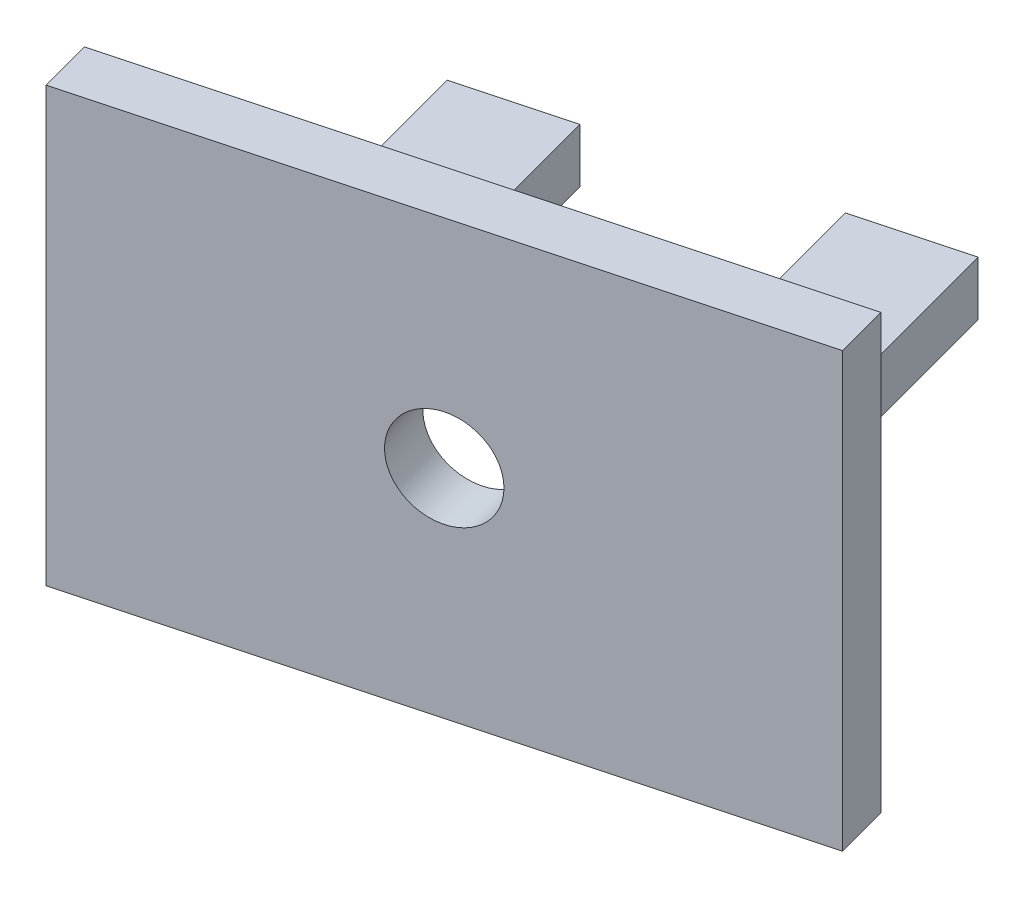
ISO-10303-21;
HEADER;
FILE_DESCRIPTION(('STEP AP214'),'2;1');
FILE_NAME('part.step','',(''),(''),'','','');
FILE_SCHEMA(('AUTOMOTIVE_DESIGN { 1 0 10303 214 1 1 1 1 }'));
ENDSEC;
DATA;
#1=APPLICATION_CONTEXT('core data for automotive mechanical design processes');
#2=APPLICATION_PROTOCOL_DEFINITION('international standard','automotive_design',2000,#1);
#3=PRODUCT_CONTEXT('',#1,'mechanical');
#4=PRODUCT('Part','Part','',(#3));
#5=PRODUCT_RELATED_PRODUCT_CATEGORY('part','',(#4));
#6=PRODUCT_DEFINITION_FORMATION('','',#4);
#7=PRODUCT_DEFINITION_CONTEXT('part definition',#1,'design');
#8=PRODUCT_DEFINITION('design','',#6,#7);
#9=PRODUCT_DEFINITION_SHAPE('','',#8);
#10=(LENGTH_UNIT() NAMED_UNIT(*) SI_UNIT(.MILLI.,.METRE.));
#11=(NAMED_UNIT(*) PLANE_ANGLE_UNIT() SI_UNIT($,.RADIAN.));
#12=(NAMED_UNIT(*) SI_UNIT($,.STERADIAN.) SOLID_ANGLE_UNIT());
#13=UNCERTAINTY_MEASURE_WITH_UNIT(LENGTH_MEASURE(1.E-05),#10,'distance_accuracy_value','');
#14=(GEOMETRIC_REPRESENTATION_CONTEXT(3) GLOBAL_UNCERTAINTY_ASSIGNED_CONTEXT((#13)) GLOBAL_UNIT_ASSIGNED_CONTEXT((#10,
#11,#12)) REPRESENTATION_CONTEXT('',''));
#15=CARTESIAN_POINT('',(0.,0.,0.));
#16=DIRECTION('',(0.,0.,1.));
#17=DIRECTION('',(1.,0.,0.));
#18=AXIS2_PLACEMENT_3D('',#15,#16,#17);
#19=CARTESIAN_POINT('',(1833.308635925,574.5,2490.475513761));
#20=DIRECTION('',(0.258819045102985,0.,0.965925826288944));
#21=DIRECTION('',(0.,-1.,0.));
#22=AXIS2_PLACEMENT_3D('',#19,#20,#21);
#23=PLANE('',#22);
#24=DIRECTION('',(0.965925826288944,0.,-0.258819045102985));
#25=VECTOR('',#24,1.);
#26=CARTESIAN_POINT('',(1833.308635925,579.5,2490.475513761));
#27=LINE('',#26,#25);
#28=CARTESIAN_POINT('',(1833.308635925,579.5,2490.475513761));
#29=VERTEX_POINT('',#28);
#30=CARTESIAN_POINT('',(1842.967894188,579.5,2487.88732331));
#31=VERTEX_POINT('',#30);
#32=EDGE_CURVE('E147',#29,#31,#27,.T.);
#33=ORIENTED_EDGE('',*,*,#32,.T.);
#34=DIRECTION('',(0.,1.,0.));
#35=VECTOR('',#34,1.);
#36=CARTESIAN_POINT('',(1842.967894188,574.5,2487.88732331));
#37=LINE('',#36,#35);
#38=CARTESIAN_POINT('',(1842.967894188,574.5,2487.88732331));
#39=VERTEX_POINT('',#38);
#40=EDGE_CURVE('E11',#39,#31,#37,.T.);
#41=ORIENTED_EDGE('',*,*,#40,.F.);
#42=DIRECTION('',(0.965925826288944,0.,-0.258819045102985));
#43=VECTOR('',#42,1.);
#44=CARTESIAN_POINT('',(1833.308635925,574.5,2490.475513761));
#45=LINE('',#44,#43);
#46=CARTESIAN_POINT('',(1833.308635925,574.5,2490.475513761));
#47=VERTEX_POINT('',#46);
#48=EDGE_CURVE('E210',#47,#39,#45,.T.);
#49=ORIENTED_EDGE('',*,*,#48,.F.);
#50=DIRECTION('',(0.,1.,0.));
#51=VECTOR('',#50,1.);
#52=CARTESIAN_POINT('',(1833.308635925,574.5,2490.475513761));
#53=LINE('',#52,#51);
#54=EDGE_CURVE('E152',#47,#29,#53,.T.);
#55=ORIENTED_EDGE('',*,*,#54,.T.);
#56=EDGE_LOOP('',(#33,#41,#49,#55));
#57=FACE_BOUND('',#56,.T.);
#58=ADVANCED_FACE('F17',(#57),#23,.F.);
#59=CARTESIAN_POINT('',(1804.330861137,574.5,2498.240085114));
#60=DIRECTION('',(0.258819045102985,0.,0.965925826288944));
#61=DIRECTION('',(0.,-1.,0.));
#62=AXIS2_PLACEMENT_3D('',#59,#60,#61);
#63=PLANE('',#62);
#64=DIRECTION('',(0.965925826288944,0.,-0.258819045102985));
#65=VECTOR('',#64,1.);
#66=CARTESIAN_POINT('',(1804.330861137,579.5,2498.240085114));
#67=LINE('',#66,#65);
#68=CARTESIAN_POINT('',(1804.330861137,579.5,2498.240085114));
#69=VERTEX_POINT('',#68);
#70=CARTESIAN_POINT('',(1813.990119399,579.5,2495.651894663));
#71=VERTEX_POINT('',#70);
#72=EDGE_CURVE('E191',#69,#71,#67,.T.);
#73=ORIENTED_EDGE('',*,*,#72,.T.);
#74=DIRECTION('',(0.,1.,0.));
#75=VECTOR('',#74,1.);
#76=CARTESIAN_POINT('',(1813.990119399,574.5,2495.651894663));
#77=LINE('',#76,#75);
#78=CARTESIAN_POINT('',(1813.990119399,574.5,2495.651894663));
#79=VERTEX_POINT('',#78);
#80=EDGE_CURVE('E198',#79,#71,#77,.T.);
#81=ORIENTED_EDGE('',*,*,#80,.F.);
#82=DIRECTION('',(0.965925826288944,0.,-0.258819045102985));
#83=VECTOR('',#82,1.);
#84=CARTESIAN_POINT('',(1804.330861137,574.5,2498.240085114));
#85=LINE('',#84,#83);
#86=CARTESIAN_POINT('',(1804.330861137,574.5,2498.240085114));
#87=VERTEX_POINT('',#86);
#88=EDGE_CURVE('E187',#87,#79,#85,.T.);
#89=ORIENTED_EDGE('',*,*,#88,.F.);
#90=DIRECTION('',(0.,1.,0.));
#91=VECTOR('',#90,1.);
#92=CARTESIAN_POINT('',(1804.330861137,574.5,2498.240085114));
#93=LINE('',#92,#91);
#94=EDGE_CURVE('E178',#87,#69,#93,.T.);
#95=ORIENTED_EDGE('',*,*,#94,.T.);
#96=EDGE_LOOP('',(#73,#81,#89,#95));
#97=FACE_BOUND('',#96,.T.);
#98=ADVANCED_FACE('F322',(#97),#63,.F.);
#99=CARTESIAN_POINT('',(1842.967894188,574.5,2487.88732331));
#100=DIRECTION('',(0.965925826288944,0.,-0.258819045102985));
#101=DIRECTION('',(0.,-1.,0.));
#102=AXIS2_PLACEMENT_3D('',#99,#100,#101);
#103=PLANE('',#102);
#104=DIRECTION('',(0.258819045102985,0.,0.965925826288944));
#105=VECTOR('',#104,1.);
#106=CARTESIAN_POINT('',(1842.967894188,574.5,2487.88732331));
#107=LINE('',#106,#105);
#108=CARTESIAN_POINT('',(1850.732465541,574.5,2516.865098098));
#109=VERTEX_POINT('',#108);
#110=EDGE_CURVE('E207',#39,#109,#107,.T.);
#111=ORIENTED_EDGE('',*,*,#110,.F.);
#112=ORIENTED_EDGE('',*,*,#40,.T.);
#113=DIRECTION('',(0.258819045102985,0.,0.965925826288944));
#114=VECTOR('',#113,1.);
#115=CARTESIAN_POINT('',(1842.967894188,579.5,2487.88732331));
#116=LINE('',#115,#114);
#117=CARTESIAN_POINT('',(1850.732465541,579.5,2516.865098098));
#118=VERTEX_POINT('',#117);
#119=EDGE_CURVE('E25',#31,#118,#116,.T.);
#120=ORIENTED_EDGE('',*,*,#119,.T.);
#121=DIRECTION('',(0.,1.,0.));
#122=VECTOR('',#121,1.);
#123=CARTESIAN_POINT('',(1850.732465541,574.5,2516.865098098));
#124=LINE('',#123,#122);
#125=EDGE_CURVE('E169',#109,#118,#124,.T.);
#126=ORIENTED_EDGE('',*,*,#125,.F.);
#127=EDGE_LOOP('',(#111,#112,#120,#126));
#128=FACE_BOUND('',#127,.T.);
#129=ADVANCED_FACE('F216',(#128),#103,.T.);
#130=CARTESIAN_POINT('',(1833.308635925,579.5,2490.475513761));
#131=DIRECTION('',(0.,1.,0.));
#132=DIRECTION('',(1.,0.,0.));
#133=AXIS2_PLACEMENT_3D('',#130,#131,#132);
#134=PLANE('',#133);
#135=ORIENTED_EDGE('',*,*,#32,.F.);
#136=DIRECTION('',(0.258819045102985,0.,0.965925826288944));
#137=VECTOR('',#136,1.);
#138=CARTESIAN_POINT('',(1833.308635925,579.5,2490.475513761));
#139=LINE('',#138,#137);
#140=CARTESIAN_POINT('',(1841.073207278,579.5,2519.453288549));
#141=VERTEX_POINT('',#140);
#142=EDGE_CURVE('E141',#29,#141,#139,.T.);
#143=ORIENTED_EDGE('',*,*,#142,.T.);
#144=DIRECTION('',(0.965925826288944,0.,-0.258819045102985));
#145=VECTOR('',#144,1.);
#146=CARTESIAN_POINT('',(1841.073207278,579.5,2519.453288549));
#147=LINE('',#146,#145);
#148=EDGE_CURVE('E145',#141,#118,#147,.T.);
#149=ORIENTED_EDGE('',*,*,#148,.T.);
#150=ORIENTED_EDGE('',*,*,#119,.F.);
#151=EDGE_LOOP('',(#135,#143,#149,#150));
#152=FACE_BOUND('',#151,.T.);
#153=ADVANCED_FACE('F143',(#152),#134,.T.);
#154=CARTESIAN_POINT('',(1833.308635925,574.5,2490.475513761));
#155=DIRECTION('',(0.,1.,0.));
#156=DIRECTION('',(1.,0.,0.));
#157=AXIS2_PLACEMENT_3D('',#154,#155,#156);
#158=PLANE('',#157);
#159=ORIENTED_EDGE('',*,*,#110,.T.);
#160=DIRECTION('',(0.965925826288944,0.,-0.258819045102985));
#161=VECTOR('',#160,1.);
#162=CARTESIAN_POINT('',(1841.073207278,574.5,2519.453288549));
#163=LINE('',#162,#161);
#164=CARTESIAN_POINT('',(1841.073207278,574.5,2519.453288549));
#165=VERTEX_POINT('',#164);
#166=EDGE_CURVE('E174',#165,#109,#163,.T.);
#167=ORIENTED_EDGE('',*,*,#166,.F.);
#168=DIRECTION('',(0.258819045102985,0.,0.965925826288944));
#169=VECTOR('',#168,1.);
#170=CARTESIAN_POINT('',(1833.308635925,574.5,2490.475513761));
#171=LINE('',#170,#169);
#172=EDGE_CURVE('E159',#47,#165,#171,.T.);
#173=ORIENTED_EDGE('',*,*,#172,.F.);
#174=ORIENTED_EDGE('',*,*,#48,.T.);
#175=EDGE_LOOP('',(#159,#167,#173,#174));
#176=FACE_BOUND('',#175,.T.);
#177=ADVANCED_FACE('F218',(#176),#158,.F.);
#178=CARTESIAN_POINT('',(1833.308635925,574.5,2490.475513761));
#179=DIRECTION('',(0.965925826288944,0.,-0.258819045102985));
#180=DIRECTION('',(0.,-1.,0.));
#181=AXIS2_PLACEMENT_3D('',#178,#179,#180);
#182=PLANE('',#181);
#183=DIRECTION('',(0.,1.,0.));
#184=VECTOR('',#183,1.);
#185=CARTESIAN_POINT('',(1841.073207278,574.5,2519.453288549));
#186=LINE('',#185,#184);
#187=EDGE_CURVE('E156',#165,#141,#186,.T.);
#188=ORIENTED_EDGE('',*,*,#187,.T.);
#189=ORIENTED_EDGE('',*,*,#142,.F.);
#190=ORIENTED_EDGE('',*,*,#54,.F.);
#191=ORIENTED_EDGE('',*,*,#172,.T.);
#192=EDGE_LOOP('',(#188,#189,#190,#191));
#193=FACE_BOUND('',#192,.T.);
#194=ADVANCED_FACE('F157',(#193),#182,.F.);
#195=CARTESIAN_POINT('',(1831.388067111,577.,2521.944886418));
#196=DIRECTION('',(-0.258819045102985,0.,-0.965925826288944));
#197=DIRECTION('',(0.965925826288944,0.,-0.258819045102985));
#198=AXIS2_PLACEMENT_3D('',#195,#196,#197);
#199=CYLINDRICAL_SURFACE('',#198,4.5);
#200=CARTESIAN_POINT('',(1831.413949016,577.,2522.041479001));
#201=DIRECTION('',(-0.258819045102985,0.,-0.965925826288944));
#202=DIRECTION('',(0.965925826288944,0.,-0.258819045102985));
#203=AXIS2_PLACEMENT_3D('',#200,#201,#202);
#204=CIRCLE('',#203,4.5);
#205=CARTESIAN_POINT('',(1835.760615234,577.,2520.876793298));
#206=VERTEX_POINT('',#205);
#207=EDGE_CURVE('E220',#206,#206,#204,.T.);
#208=ORIENTED_EDGE('',*,*,#207,.T.);
#209=DIRECTION('',(0.258819045102985,0.,0.965925826288944));
#210=VECTOR('',#209,1.);
#211=CARTESIAN_POINT('',(1835.734733329,577.,2520.780200715));
#212=LINE('',#211,#210);
#213=CARTESIAN_POINT('',(1837.054710459,577.,2525.706422429));
#214=VERTEX_POINT('',#213);
#215=EDGE_CURVE('E153',#206,#214,#212,.T.);
#216=ORIENTED_EDGE('',*,*,#215,.T.);
#217=CARTESIAN_POINT('',(1832.708044241,577.,2526.871108132));
#218=DIRECTION('',(-0.258819045102985,0.,-0.965925826288944));
#219=DIRECTION('',(0.965925826288944,0.,-0.258819045102985));
#220=AXIS2_PLACEMENT_3D('',#217,#218,#219);
#221=CIRCLE('',#220,4.5);
#222=EDGE_CURVE('E229',#214,#214,#221,.T.);
#223=ORIENTED_EDGE('',*,*,#222,.F.);
#224=ORIENTED_EDGE('',*,*,#215,.F.);
#225=EDGE_LOOP('',(#208,#216,#223,#224));
#226=FACE_BOUND('',#225,.T.);
#227=ADVANCED_FACE('F359',(#226),#199,.F.);
#228=CARTESIAN_POINT('',(1813.990119399,574.5,2495.651894663));
#229=DIRECTION('',(0.965925826288944,0.,-0.258819045102985));
#230=DIRECTION('',(0.,-1.,0.));
#231=AXIS2_PLACEMENT_3D('',#228,#229,#230);
#232=PLANE('',#231);
#233=DIRECTION('',(0.258819045102985,0.,0.965925826288944));
#234=VECTOR('',#233,1.);
#235=CARTESIAN_POINT('',(1813.990119399,574.5,2495.651894663));
#236=LINE('',#235,#234);
#237=CARTESIAN_POINT('',(1821.754690753,574.5,2524.629669451));
#238=VERTEX_POINT('',#237);
#239=EDGE_CURVE('E186',#79,#238,#236,.T.);
#240=ORIENTED_EDGE('',*,*,#239,.F.);
#241=ORIENTED_EDGE('',*,*,#80,.T.);
#242=DIRECTION('',(0.258819045102985,0.,0.965925826288944));
#243=VECTOR('',#242,1.);
#244=CARTESIAN_POINT('',(1813.990119399,579.5,2495.651894663));
#245=LINE('',#244,#243);
#246=CARTESIAN_POINT('',(1821.754690753,579.5,2524.629669451));
#247=VERTEX_POINT('',#246);
#248=EDGE_CURVE('E195',#71,#247,#245,.T.);
#249=ORIENTED_EDGE('',*,*,#248,.T.);
#250=DIRECTION('',(0.,1.,0.));
#251=VECTOR('',#250,1.);
#252=CARTESIAN_POINT('',(1821.754690753,574.5,2524.629669451));
#253=LINE('',#252,#251);
#254=EDGE_CURVE('E234',#238,#247,#253,.T.);
#255=ORIENTED_EDGE('',*,*,#254,.F.);
#256=EDGE_LOOP('',(#240,#241,#249,#255));
#257=FACE_BOUND('',#256,.T.);
#258=ADVANCED_FACE('F355',(#257),#232,.T.);
#259=CARTESIAN_POINT('',(1804.330861137,579.5,2498.240085114));
#260=DIRECTION('',(0.,1.,0.));
#261=DIRECTION('',(1.,0.,0.));
#262=AXIS2_PLACEMENT_3D('',#259,#260,#261);
#263=PLANE('',#262);
#264=ORIENTED_EDGE('',*,*,#72,.F.);
#265=DIRECTION('',(0.258819045102985,0.,0.965925826288944));
#266=VECTOR('',#265,1.);
#267=CARTESIAN_POINT('',(1804.330861137,579.5,2498.240085114));
#268=LINE('',#267,#266);
#269=CARTESIAN_POINT('',(1812.09543249,579.5,2527.217859903));
#270=VERTEX_POINT('',#269);
#271=EDGE_CURVE('E183',#69,#270,#268,.T.);
#272=ORIENTED_EDGE('',*,*,#271,.T.);
#273=DIRECTION('',(0.965925826288944,0.,-0.258819045102985));
#274=VECTOR('',#273,1.);
#275=CARTESIAN_POINT('',(1812.09543249,579.5,2527.217859903));
#276=LINE('',#275,#274);
#277=EDGE_CURVE('E230',#270,#247,#276,.T.);
#278=ORIENTED_EDGE('',*,*,#277,.T.);
#279=ORIENTED_EDGE('',*,*,#248,.F.);
#280=EDGE_LOOP('',(#264,#272,#278,#279));
#281=FACE_BOUND('',#280,.T.);
#282=ADVANCED_FACE('F352',(#281),#263,.T.);
#283=CARTESIAN_POINT('',(1804.330861137,574.5,2498.240085114));
#284=DIRECTION('',(0.,1.,0.));
#285=DIRECTION('',(1.,0.,0.));
#286=AXIS2_PLACEMENT_3D('',#283,#284,#285);
#287=PLANE('',#286);
#288=ORIENTED_EDGE('',*,*,#239,.T.);
#289=DIRECTION('',(0.965925826288944,0.,-0.258819045102985));
#290=VECTOR('',#289,1.);
#291=CARTESIAN_POINT('',(1812.09543249,574.5,2527.217859903));
#292=LINE('',#291,#290);
#293=CARTESIAN_POINT('',(1812.09543249,574.5,2527.217859903));
#294=VERTEX_POINT('',#293);
#295=EDGE_CURVE('E242',#294,#238,#292,.T.);
#296=ORIENTED_EDGE('',*,*,#295,.F.);
#297=DIRECTION('',(0.258819045102985,0.,0.965925826288944));
#298=VECTOR('',#297,1.);
#299=CARTESIAN_POINT('',(1804.330861137,574.5,2498.240085114));
#300=LINE('',#299,#298);
#301=EDGE_CURVE('E182',#87,#294,#300,.T.);
#302=ORIENTED_EDGE('',*,*,#301,.F.);
#303=ORIENTED_EDGE('',*,*,#88,.T.);
#304=EDGE_LOOP('',(#288,#296,#302,#303));
#305=FACE_BOUND('',#304,.T.);
#306=ADVANCED_FACE('F336',(#305),#287,.F.);
#307=CARTESIAN_POINT('',(1804.330861137,574.5,2498.240085114));
#308=DIRECTION('',(0.965925826288944,0.,-0.258819045102985));
#309=DIRECTION('',(0.,-1.,0.));
#310=AXIS2_PLACEMENT_3D('',#307,#308,#309);
#311=PLANE('',#310);
#312=DIRECTION('',(0.,1.,0.));
#313=VECTOR('',#312,1.);
#314=CARTESIAN_POINT('',(1812.09543249,574.5,2527.217859903));
#315=LINE('',#314,#313);
#316=EDGE_CURVE('E225',#294,#270,#315,.T.);
#317=ORIENTED_EDGE('',*,*,#316,.T.);
#318=ORIENTED_EDGE('',*,*,#271,.F.);
#319=ORIENTED_EDGE('',*,*,#94,.F.);
#320=ORIENTED_EDGE('',*,*,#301,.T.);
#321=EDGE_LOOP('',(#317,#318,#319,#320));
#322=FACE_BOUND('',#321,.T.);
#323=ADVANCED_FACE('F346',(#322),#311,.F.);
#324=CARTESIAN_POINT('',(1860.391723804,557.,2514.276907647));
#325=DIRECTION('',(0.965925826288944,0.,-0.258819045102985));
#326=DIRECTION('',(0.,-1.,0.));
#327=AXIS2_PLACEMENT_3D('',#324,#325,#326);
#328=PLANE('',#327);
#329=DIRECTION('',(0.258819045102985,0.,0.965925826288944));
#330=VECTOR('',#329,1.);
#331=CARTESIAN_POINT('',(1860.391723804,557.,2514.276907647));
#332=LINE('',#331,#330);
#333=CARTESIAN_POINT('',(1860.391723804,557.,2514.276907647));
#334=VERTEX_POINT('',#333);
#335=CARTESIAN_POINT('',(1861.68581903,557.,2519.106536779));
#336=VERTEX_POINT('',#335);
#337=EDGE_CURVE('E258',#334,#336,#332,.T.);
#338=ORIENTED_EDGE('',*,*,#337,.F.);
#339=DIRECTION('',(0.,1.,0.));
#340=VECTOR('',#339,1.);
#341=CARTESIAN_POINT('',(1860.391723804,557.,2514.276907647));
#342=LINE('',#341,#340);
#343=CARTESIAN_POINT('',(1860.391723804,597.,2514.276907647));
#344=VERTEX_POINT('',#343);
#345=EDGE_CURVE('E243',#334,#344,#342,.T.);
#346=ORIENTED_EDGE('',*,*,#345,.T.);
#347=DIRECTION('',(0.258819045102985,0.,0.965925826288944));
#348=VECTOR('',#347,1.);
#349=CARTESIAN_POINT('',(1860.391723804,597.,2514.276907647));
#350=LINE('',#349,#348);
#351=CARTESIAN_POINT('',(1861.68581903,597.,2519.106536779));
#352=VERTEX_POINT('',#351);
#353=EDGE_CURVE('E278',#344,#352,#350,.T.);
#354=ORIENTED_EDGE('',*,*,#353,.T.);
#355=DIRECTION('',(0.,1.,0.));
#356=VECTOR('',#355,1.);
#357=CARTESIAN_POINT('',(1861.68581903,557.,2519.106536779));
#358=LINE('',#357,#356);
#359=EDGE_CURVE('E238',#336,#352,#358,.T.);
#360=ORIENTED_EDGE('',*,*,#359,.F.);
#361=EDGE_LOOP('',(#338,#346,#354,#360));
#362=FACE_BOUND('',#361,.T.);
#363=ADVANCED_FACE('F298',(#362),#328,.T.);
#364=CARTESIAN_POINT('',(1803.730269452,557.,2534.635679485));
#365=DIRECTION('',(0.258819045102985,0.,0.965925826288944));
#366=DIRECTION('',(0.,-1.,0.));
#367=AXIS2_PLACEMENT_3D('',#364,#365,#366);
#368=PLANE('',#367);
#369=ORIENTED_EDGE('',*,*,#222,.T.);
#370=EDGE_LOOP('',(#369));
#371=FACE_BOUND('',#370,.T.);
#372=DIRECTION('',(0.,1.,0.));
#373=VECTOR('',#372,1.);
#374=CARTESIAN_POINT('',(1803.730269452,557.,2534.635679485));
#375=LINE('',#374,#373);
#376=CARTESIAN_POINT('',(1803.730269452,557.,2534.635679485));
#377=VERTEX_POINT('',#376);
#378=CARTESIAN_POINT('',(1803.730269452,597.,2534.635679485));
#379=VERTEX_POINT('',#378);
#380=EDGE_CURVE('E274',#377,#379,#375,.T.);
#381=ORIENTED_EDGE('',*,*,#380,.F.);
#382=DIRECTION('',(0.965925826288944,0.,-0.258819045102985));
#383=VECTOR('',#382,1.);
#384=CARTESIAN_POINT('',(1803.730269452,557.,2534.635679485));
#385=LINE('',#384,#383);
#386=EDGE_CURVE('E263',#377,#336,#385,.T.);
#387=ORIENTED_EDGE('',*,*,#386,.T.);
#388=ORIENTED_EDGE('',*,*,#359,.T.);
#389=DIRECTION('',(0.965925826288944,0.,-0.258819045102985));
#390=VECTOR('',#389,1.);
#391=CARTESIAN_POINT('',(1803.730269452,597.,2534.635679485));
#392=LINE('',#391,#390);
#393=EDGE_CURVE('E164',#379,#352,#392,.T.);
#394=ORIENTED_EDGE('',*,*,#393,.F.);
#395=EDGE_LOOP('',(#381,#387,#388,#394));
#396=FACE_BOUND('',#395,.T.);
#397=ADVANCED_FACE('F304',(#371,#396),#368,.T.);
#398=CARTESIAN_POINT('',(1802.436174227,597.,2529.806050354));
#399=DIRECTION('',(0.,1.,0.));
#400=DIRECTION('',(1.,0.,0.));
#401=AXIS2_PLACEMENT_3D('',#398,#399,#400);
#402=PLANE('',#401);
#403=DIRECTION('',(0.965925826288944,0.,-0.258819045102985));
#404=VECTOR('',#403,1.);
#405=CARTESIAN_POINT('',(1802.436174227,597.,2529.806050354));
#406=LINE('',#405,#404);
#407=CARTESIAN_POINT('',(1802.436174227,597.,2529.806050354));
#408=VERTEX_POINT('',#407);
#409=EDGE_CURVE('E247',#408,#344,#406,.T.);
#410=ORIENTED_EDGE('',*,*,#409,.F.);
#411=DIRECTION('',(0.258819045102985,0.,0.965925826288944));
#412=VECTOR('',#411,1.);
#413=CARTESIAN_POINT('',(1802.436174227,597.,2529.806050354));
#414=LINE('',#413,#412);
#415=EDGE_CURVE('E267',#408,#379,#414,.T.);
#416=ORIENTED_EDGE('',*,*,#415,.T.);
#417=ORIENTED_EDGE('',*,*,#393,.T.);
#418=ORIENTED_EDGE('',*,*,#353,.F.);
#419=EDGE_LOOP('',(#410,#416,#417,#418));
#420=FACE_BOUND('',#419,.T.);
#421=ADVANCED_FACE('F300',(#420),#402,.T.);
#422=CARTESIAN_POINT('',(1802.436174227,557.,2529.806050354));
#423=DIRECTION('',(0.258819045102985,0.,0.965925826288944));
#424=DIRECTION('',(0.,-1.,0.));
#425=AXIS2_PLACEMENT_3D('',#422,#423,#424);
#426=PLANE('',#425);
#427=ORIENTED_EDGE('',*,*,#166,.T.);
#428=ORIENTED_EDGE('',*,*,#125,.T.);
#429=ORIENTED_EDGE('',*,*,#148,.F.);
#430=ORIENTED_EDGE('',*,*,#187,.F.);
#431=EDGE_LOOP('',(#427,#428,#429,#430));
#432=FACE_BOUND('',#431,.T.);
#433=ORIENTED_EDGE('',*,*,#207,.F.);
#434=EDGE_LOOP('',(#433));
#435=FACE_BOUND('',#434,.T.);
#436=ORIENTED_EDGE('',*,*,#295,.T.);
#437=ORIENTED_EDGE('',*,*,#254,.T.);
#438=ORIENTED_EDGE('',*,*,#277,.F.);
#439=ORIENTED_EDGE('',*,*,#316,.F.);
#440=EDGE_LOOP('',(#436,#437,#438,#439));
#441=FACE_BOUND('',#440,.T.);
#442=ORIENTED_EDGE('',*,*,#409,.T.);
#443=ORIENTED_EDGE('',*,*,#345,.F.);
#444=DIRECTION('',(0.965925826288944,0.,-0.258819045102985));
#445=VECTOR('',#444,1.);
#446=CARTESIAN_POINT('',(1802.436174227,557.,2529.806050354));
#447=LINE('',#446,#445);
#448=CARTESIAN_POINT('',(1802.436174227,557.,2529.806050354));
#449=VERTEX_POINT('',#448);
#450=EDGE_CURVE('E252',#449,#334,#447,.T.);
#451=ORIENTED_EDGE('',*,*,#450,.F.);
#452=DIRECTION('',(0.,1.,0.));
#453=VECTOR('',#452,1.);
#454=CARTESIAN_POINT('',(1802.436174227,557.,2529.806050354));
#455=LINE('',#454,#453);
#456=EDGE_CURVE('E259',#449,#408,#455,.T.);
#457=ORIENTED_EDGE('',*,*,#456,.T.);
#458=EDGE_LOOP('',(#442,#443,#451,#457));
#459=FACE_BOUND('',#458,.T.);
#460=ADVANCED_FACE('F166',(#432,#435,#441,#459),#426,.F.);
#461=CARTESIAN_POINT('',(1802.436174227,557.,2529.806050354));
#462=DIRECTION('',(0.,1.,0.));
#463=DIRECTION('',(1.,0.,0.));
#464=AXIS2_PLACEMENT_3D('',#461,#462,#463);
#465=PLANE('',#464);
#466=ORIENTED_EDGE('',*,*,#337,.T.);
#467=ORIENTED_EDGE('',*,*,#386,.F.);
#468=DIRECTION('',(0.258819045102985,0.,0.965925826288944));
#469=VECTOR('',#468,1.);
#470=CARTESIAN_POINT('',(1802.436174227,557.,2529.806050354));
#471=LINE('',#470,#469);
#472=EDGE_CURVE('E254',#449,#377,#471,.T.);
#473=ORIENTED_EDGE('',*,*,#472,.F.);
#474=ORIENTED_EDGE('',*,*,#450,.T.);
#475=EDGE_LOOP('',(#466,#467,#473,#474));
#476=FACE_BOUND('',#475,.T.);
#477=ADVANCED_FACE('F307',(#476),#465,.F.);
#478=CARTESIAN_POINT('',(1802.436174227,557.,2529.806050354));
#479=DIRECTION('',(0.965925826288944,0.,-0.258819045102985));
#480=DIRECTION('',(0.,-1.,0.));
#481=AXIS2_PLACEMENT_3D('',#478,#479,#480);
#482=PLANE('',#481);
#483=ORIENTED_EDGE('',*,*,#380,.T.);
#484=ORIENTED_EDGE('',*,*,#415,.F.);
#485=ORIENTED_EDGE('',*,*,#456,.F.);
#486=ORIENTED_EDGE('',*,*,#472,.T.);
#487=EDGE_LOOP('',(#483,#484,#485,#486));
#488=FACE_BOUND('',#487,.T.);
#489=ADVANCED_FACE('F311',(#488),#482,.F.);
#490=CLOSED_SHELL('',(#58,#98,#129,#153,#177,#194,#227,#258,#282,#306,#323,#363,#397,#421,#460,
#477,#489));
#491=MANIFOLD_SOLID_BREP('B1',#490);
#492=ADVANCED_BREP_SHAPE_REPRESENTATION('',(#18,#491),#14);
#493=SHAPE_DEFINITION_REPRESENTATION(#9,#492);
ENDSEC;
END-ISO-10303-21;
